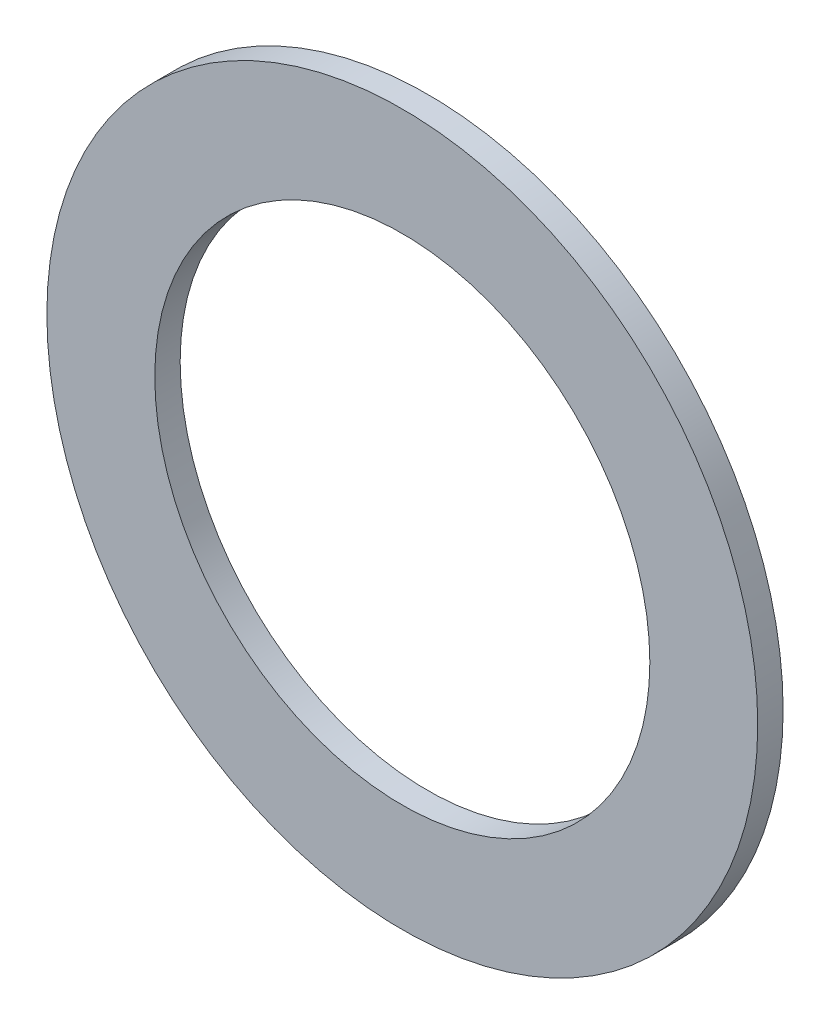
ISO-10303-21;
HEADER;
FILE_DESCRIPTION(('STEP AP214'),'2;1');
FILE_NAME('part.step','',(''),(''),'','','');
FILE_SCHEMA(('AUTOMOTIVE_DESIGN { 1 0 10303 214 1 1 1 1 }'));
ENDSEC;
DATA;
#1=APPLICATION_CONTEXT('core data for automotive mechanical design processes');
#2=APPLICATION_PROTOCOL_DEFINITION('international standard','automotive_design',2000,#1);
#3=PRODUCT_CONTEXT('',#1,'mechanical');
#4=PRODUCT('Part','Part','',(#3));
#5=PRODUCT_RELATED_PRODUCT_CATEGORY('part','',(#4));
#6=PRODUCT_DEFINITION_FORMATION('','',#4);
#7=PRODUCT_DEFINITION_CONTEXT('part definition',#1,'design');
#8=PRODUCT_DEFINITION('design','',#6,#7);
#9=PRODUCT_DEFINITION_SHAPE('','',#8);
#10=(LENGTH_UNIT() NAMED_UNIT(*) SI_UNIT(.MILLI.,.METRE.));
#11=(NAMED_UNIT(*) PLANE_ANGLE_UNIT() SI_UNIT($,.RADIAN.));
#12=(NAMED_UNIT(*) SI_UNIT($,.STERADIAN.) SOLID_ANGLE_UNIT());
#13=UNCERTAINTY_MEASURE_WITH_UNIT(LENGTH_MEASURE(1.E-05),#10,'distance_accuracy_value','');
#14=(GEOMETRIC_REPRESENTATION_CONTEXT(3) GLOBAL_UNCERTAINTY_ASSIGNED_CONTEXT((#13)) GLOBAL_UNIT_ASSIGNED_CONTEXT((#10,
#11,#12)) REPRESENTATION_CONTEXT('',''));
#15=CARTESIAN_POINT('',(0.,0.,0.));
#16=DIRECTION('',(0.,0.,1.));
#17=DIRECTION('',(1.,0.,0.));
#18=AXIS2_PLACEMENT_3D('',#15,#16,#17);
#19=CARTESIAN_POINT('',(0.,0.,1.));
#20=DIRECTION('',(0.,0.,1.));
#21=DIRECTION('',(1.,0.,0.));
#22=AXIS2_PLACEMENT_3D('',#19,#20,#21);
#23=PLANE('',#22);
#24=CARTESIAN_POINT('',(0.,0.,1.));
#25=DIRECTION('',(0.,0.,1.));
#26=DIRECTION('',(1.,0.,0.));
#27=AXIS2_PLACEMENT_3D('',#24,#25,#26);
#28=CIRCLE('',#27,14.);
#29=CARTESIAN_POINT('',(14.,0.,1.));
#30=VERTEX_POINT('',#29);
#31=EDGE_CURVE('E10',#30,#30,#28,.T.);
#32=ORIENTED_EDGE('',*,*,#31,.T.);
#33=EDGE_LOOP('',(#32));
#34=FACE_BOUND('',#33,.T.);
#35=CARTESIAN_POINT('',(0.,0.,1.));
#36=DIRECTION('',(0.,0.,1.));
#37=DIRECTION('',(1.,0.,0.));
#38=AXIS2_PLACEMENT_3D('',#35,#36,#37);
#39=CIRCLE('',#38,9.75);
#40=CARTESIAN_POINT('',(9.75,0.,1.));
#41=VERTEX_POINT('',#40);
#42=EDGE_CURVE('E359',#41,#41,#39,.T.);
#43=ORIENTED_EDGE('',*,*,#42,.F.);
#44=EDGE_LOOP('',(#43));
#45=FACE_BOUND('',#44,.T.);
#46=ADVANCED_FACE('F348',(#34,#45),#23,.T.);
#47=CARTESIAN_POINT('',(0.,0.,0.));
#48=DIRECTION('',(0.,0.,1.));
#49=DIRECTION('',(1.,0.,0.));
#50=AXIS2_PLACEMENT_3D('',#47,#48,#49);
#51=PLANE('',#50);
#52=CARTESIAN_POINT('',(0.,0.,0.));
#53=DIRECTION('',(0.,0.,1.));
#54=DIRECTION('',(1.,0.,0.));
#55=AXIS2_PLACEMENT_3D('',#52,#53,#54);
#56=CIRCLE('',#55,14.);
#57=CARTESIAN_POINT('',(14.,0.,0.));
#58=VERTEX_POINT('',#57);
#59=EDGE_CURVE('E355',#58,#58,#56,.T.);
#60=ORIENTED_EDGE('',*,*,#59,.F.);
#61=EDGE_LOOP('',(#60));
#62=FACE_BOUND('',#61,.T.);
#63=CARTESIAN_POINT('',(0.,0.,0.));
#64=DIRECTION('',(0.,0.,1.));
#65=DIRECTION('',(1.,0.,0.));
#66=AXIS2_PLACEMENT_3D('',#63,#64,#65);
#67=CIRCLE('',#66,9.75);
#68=CARTESIAN_POINT('',(9.75,0.,0.));
#69=VERTEX_POINT('',#68);
#70=EDGE_CURVE('E363',#69,#69,#67,.T.);
#71=ORIENTED_EDGE('',*,*,#70,.T.);
#72=EDGE_LOOP('',(#71));
#73=FACE_BOUND('',#72,.T.);
#74=ADVANCED_FACE('F369',(#62,#73),#51,.F.);
#75=CARTESIAN_POINT('',(0.,0.,1.));
#76=DIRECTION('',(0.,0.,-1.));
#77=DIRECTION('',(-1.,0.,0.));
#78=AXIS2_PLACEMENT_3D('',#75,#76,#77);
#79=CYLINDRICAL_SURFACE('',#78,14.);
#80=ORIENTED_EDGE('',*,*,#31,.F.);
#81=EDGE_LOOP('',(#80));
#82=FACE_BOUND('',#81,.T.);
#83=ORIENTED_EDGE('',*,*,#59,.T.);
#84=EDGE_LOOP('',(#83));
#85=FACE_BOUND('',#84,.T.);
#86=ADVANCED_FACE('F350',(#82,#85),#79,.T.);
#87=CARTESIAN_POINT('',(0.,0.,1.));
#88=DIRECTION('',(0.,0.,-1.));
#89=DIRECTION('',(-1.,0.,0.));
#90=AXIS2_PLACEMENT_3D('',#87,#88,#89);
#91=CYLINDRICAL_SURFACE('',#90,9.75);
#92=ORIENTED_EDGE('',*,*,#42,.T.);
#93=EDGE_LOOP('',(#92));
#94=FACE_BOUND('',#93,.T.);
#95=ORIENTED_EDGE('',*,*,#70,.F.);
#96=EDGE_LOOP('',(#95));
#97=FACE_BOUND('',#96,.T.);
#98=ADVANCED_FACE('F371',(#94,#97),#91,.F.);
#99=CLOSED_SHELL('',(#46,#74,#86,#98));
#100=MANIFOLD_SOLID_BREP('B2',#99);
#101=ADVANCED_BREP_SHAPE_REPRESENTATION('',(#18,#100),#14);
#102=SHAPE_DEFINITION_REPRESENTATION(#9,#101);
ENDSEC;
END-ISO-10303-21;
